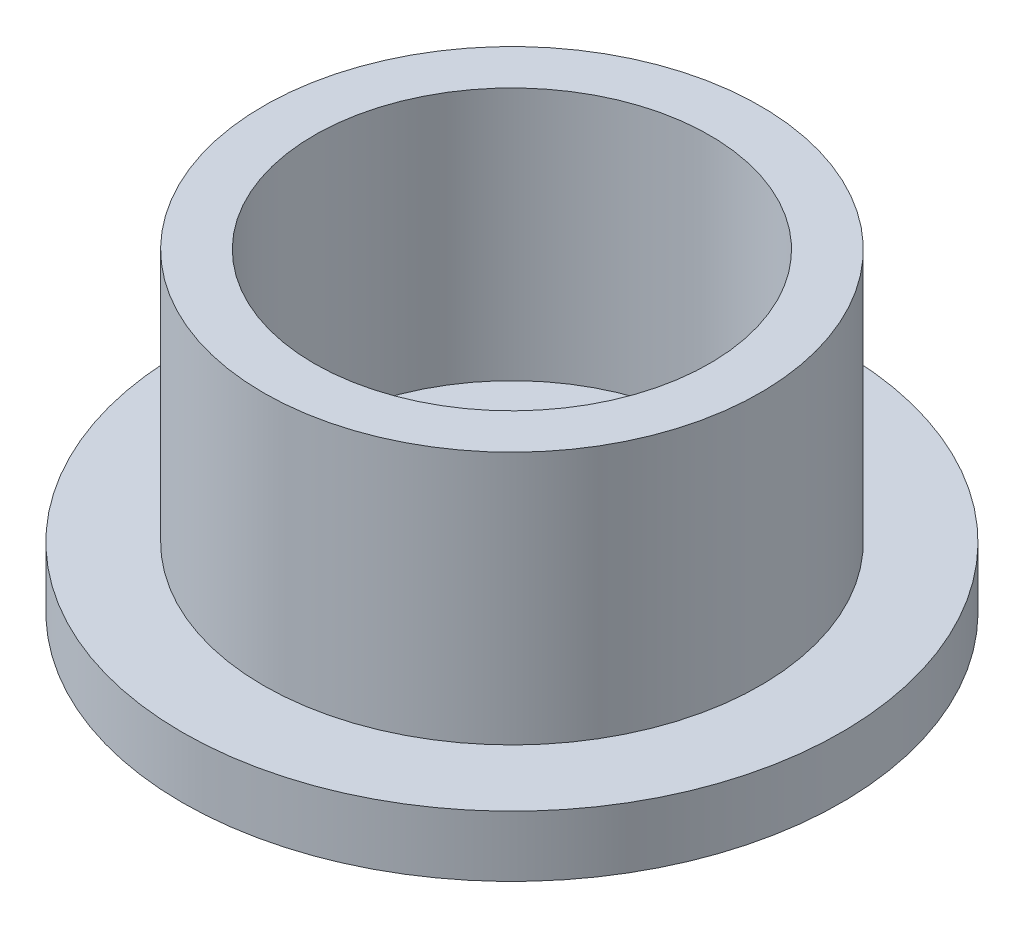
ISO-10303-21;
HEADER;
FILE_DESCRIPTION(('STEP AP214'),'2;1');
FILE_NAME('part.step','',(''),(''),'','','');
FILE_SCHEMA(('AUTOMOTIVE_DESIGN { 1 0 10303 214 1 1 1 1 }'));
ENDSEC;
DATA;
#1=APPLICATION_CONTEXT('core data for automotive mechanical design processes');
#2=APPLICATION_PROTOCOL_DEFINITION('international standard','automotive_design',2000,#1);
#3=PRODUCT_CONTEXT('',#1,'mechanical');
#4=PRODUCT('Part','Part','',(#3));
#5=PRODUCT_RELATED_PRODUCT_CATEGORY('part','',(#4));
#6=PRODUCT_DEFINITION_FORMATION('','',#4);
#7=PRODUCT_DEFINITION_CONTEXT('part definition',#1,'design');
#8=PRODUCT_DEFINITION('design','',#6,#7);
#9=PRODUCT_DEFINITION_SHAPE('','',#8);
#10=(LENGTH_UNIT() NAMED_UNIT(*) SI_UNIT(.MILLI.,.METRE.));
#11=(NAMED_UNIT(*) PLANE_ANGLE_UNIT() SI_UNIT($,.RADIAN.));
#12=(NAMED_UNIT(*) SI_UNIT($,.STERADIAN.) SOLID_ANGLE_UNIT());
#13=UNCERTAINTY_MEASURE_WITH_UNIT(LENGTH_MEASURE(1.E-05),#10,'distance_accuracy_value','');
#14=(GEOMETRIC_REPRESENTATION_CONTEXT(3) GLOBAL_UNCERTAINTY_ASSIGNED_CONTEXT((#13)) GLOBAL_UNIT_ASSIGNED_CONTEXT((#10,
#11,#12)) REPRESENTATION_CONTEXT('',''));
#15=CARTESIAN_POINT('',(0.,0.,0.));
#16=DIRECTION('',(0.,0.,1.));
#17=DIRECTION('',(1.,0.,0.));
#18=AXIS2_PLACEMENT_3D('',#15,#16,#17);
#19=CARTESIAN_POINT('',(0.,1.2,0.));
#20=DIRECTION('',(0.,-1.,0.));
#21=DIRECTION('',(0.,0.,-1.));
#22=AXIS2_PLACEMENT_3D('',#19,#20,#21);
#23=CYLINDRICAL_SURFACE('',#22,6.5);
#24=CARTESIAN_POINT('',(0.,1.2,0.));
#25=DIRECTION('',(0.,1.,0.));
#26=DIRECTION('',(0.,0.,1.));
#27=AXIS2_PLACEMENT_3D('',#24,#25,#26);
#28=CIRCLE('',#27,6.5);
#29=CARTESIAN_POINT('',(0.,1.2,6.5));
#30=VERTEX_POINT('',#29);
#31=EDGE_CURVE('E37',#30,#30,#28,.T.);
#32=ORIENTED_EDGE('',*,*,#31,.F.);
#33=EDGE_LOOP('',(#32));
#34=FACE_BOUND('',#33,.T.);
#35=CARTESIAN_POINT('',(0.,0.,0.));
#36=DIRECTION('',(0.,1.,0.));
#37=DIRECTION('',(0.,0.,1.));
#38=AXIS2_PLACEMENT_3D('',#35,#36,#37);
#39=CIRCLE('',#38,6.5);
#40=CARTESIAN_POINT('',(0.,0.,6.5));
#41=VERTEX_POINT('',#40);
#42=EDGE_CURVE('E41',#41,#41,#39,.T.);
#43=ORIENTED_EDGE('',*,*,#42,.T.);
#44=EDGE_LOOP('',(#43));
#45=FACE_BOUND('',#44,.T.);
#46=ADVANCED_FACE('F31',(#34,#45),#23,.T.);
#47=CARTESIAN_POINT('',(0.,1.2,0.));
#48=DIRECTION('',(0.,1.,0.));
#49=DIRECTION('',(0.,0.,1.));
#50=AXIS2_PLACEMENT_3D('',#47,#48,#49);
#51=PLANE('',#50);
#52=CARTESIAN_POINT('',(0.,1.2,0.));
#53=DIRECTION('',(0.,1.,0.));
#54=DIRECTION('',(0.,0.,1.));
#55=AXIS2_PLACEMENT_3D('',#52,#53,#54);
#56=CIRCLE('',#55,4.9);
#57=CARTESIAN_POINT('',(0.,1.2,4.9));
#58=VERTEX_POINT('',#57);
#59=EDGE_CURVE('E48',#58,#58,#56,.T.);
#60=ORIENTED_EDGE('',*,*,#59,.F.);
#61=EDGE_LOOP('',(#60));
#62=FACE_BOUND('',#61,.T.);
#63=ORIENTED_EDGE('',*,*,#31,.T.);
#64=EDGE_LOOP('',(#63));
#65=FACE_BOUND('',#64,.T.);
#66=ADVANCED_FACE('F72',(#62,#65),#51,.T.);
#67=CARTESIAN_POINT('',(0.,0.,0.));
#68=DIRECTION('',(0.,1.,0.));
#69=DIRECTION('',(0.,0.,1.));
#70=AXIS2_PLACEMENT_3D('',#67,#68,#69);
#71=PLANE('',#70);
#72=ORIENTED_EDGE('',*,*,#42,.F.);
#73=EDGE_LOOP('',(#72));
#74=FACE_BOUND('',#73,.T.);
#75=ADVANCED_FACE('F62',(#74),#71,.F.);
#76=CARTESIAN_POINT('',(0.,6.2,0.));
#77=DIRECTION('',(0.,1.,0.));
#78=DIRECTION('',(0.,0.,1.));
#79=AXIS2_PLACEMENT_3D('',#76,#77,#78);
#80=PLANE('',#79);
#81=CARTESIAN_POINT('',(0.,6.2,0.));
#82=DIRECTION('',(0.,1.,0.));
#83=DIRECTION('',(0.,0.,1.));
#84=AXIS2_PLACEMENT_3D('',#81,#82,#83);
#85=CIRCLE('',#84,4.9);
#86=CARTESIAN_POINT('',(0.,6.2,4.9));
#87=VERTEX_POINT('',#86);
#88=EDGE_CURVE('E46',#87,#87,#85,.T.);
#89=ORIENTED_EDGE('',*,*,#88,.T.);
#90=EDGE_LOOP('',(#89));
#91=FACE_BOUND('',#90,.T.);
#92=CARTESIAN_POINT('',(0.,6.2,0.));
#93=DIRECTION('',(0.,1.,0.));
#94=DIRECTION('',(0.,0.,1.));
#95=AXIS2_PLACEMENT_3D('',#92,#93,#94);
#96=CIRCLE('',#95,3.9);
#97=CARTESIAN_POINT('',(0.,6.2,3.9));
#98=VERTEX_POINT('',#97);
#99=EDGE_CURVE('E51',#98,#98,#96,.T.);
#100=ORIENTED_EDGE('',*,*,#99,.F.);
#101=EDGE_LOOP('',(#100));
#102=FACE_BOUND('',#101,.T.);
#103=ADVANCED_FACE('F59',(#91,#102),#80,.T.);
#104=CARTESIAN_POINT('',(0.,6.2,0.));
#105=DIRECTION('',(0.,-1.,0.));
#106=DIRECTION('',(0.,0.,-1.));
#107=AXIS2_PLACEMENT_3D('',#104,#105,#106);
#108=CYLINDRICAL_SURFACE('',#107,4.9);
#109=ORIENTED_EDGE('',*,*,#88,.F.);
#110=EDGE_LOOP('',(#109));
#111=FACE_BOUND('',#110,.T.);
#112=ORIENTED_EDGE('',*,*,#59,.T.);
#113=EDGE_LOOP('',(#112));
#114=FACE_BOUND('',#113,.T.);
#115=ADVANCED_FACE('F61',(#111,#114),#108,.T.);
#116=CARTESIAN_POINT('',(0.,6.2,0.));
#117=DIRECTION('',(0.,-1.,0.));
#118=DIRECTION('',(0.,0.,-1.));
#119=AXIS2_PLACEMENT_3D('',#116,#117,#118);
#120=CYLINDRICAL_SURFACE('',#119,3.9);
#121=ORIENTED_EDGE('',*,*,#99,.T.);
#122=EDGE_LOOP('',(#121));
#123=FACE_BOUND('',#122,.T.);
#124=CARTESIAN_POINT('',(0.,1.2,0.));
#125=DIRECTION('',(0.,1.,0.));
#126=DIRECTION('',(0.,0.,1.));
#127=AXIS2_PLACEMENT_3D('',#124,#125,#126);
#128=CIRCLE('',#127,3.9);
#129=CARTESIAN_POINT('',(0.,1.2,3.9));
#130=VERTEX_POINT('',#129);
#131=EDGE_CURVE('E10',#130,#130,#128,.F.);
#132=ORIENTED_EDGE('',*,*,#131,.T.);
#133=EDGE_LOOP('',(#132));
#134=FACE_BOUND('',#133,.T.);
#135=ADVANCED_FACE('F57',(#123,#134),#120,.F.);
#136=ORIENTED_EDGE('',*,*,#131,.F.);
#137=EDGE_LOOP('',(#136));
#138=FACE_BOUND('',#137,.T.);
#139=ADVANCED_FACE('F83',(#138),#51,.T.);
#140=CLOSED_SHELL('',(#46,#66,#75,#103,#115,#135,#139));
#141=MANIFOLD_SOLID_BREP('B2',#140);
#142=ADVANCED_BREP_SHAPE_REPRESENTATION('',(#18,#141),#14);
#143=SHAPE_DEFINITION_REPRESENTATION(#9,#142);
ENDSEC;
END-ISO-10303-21;
